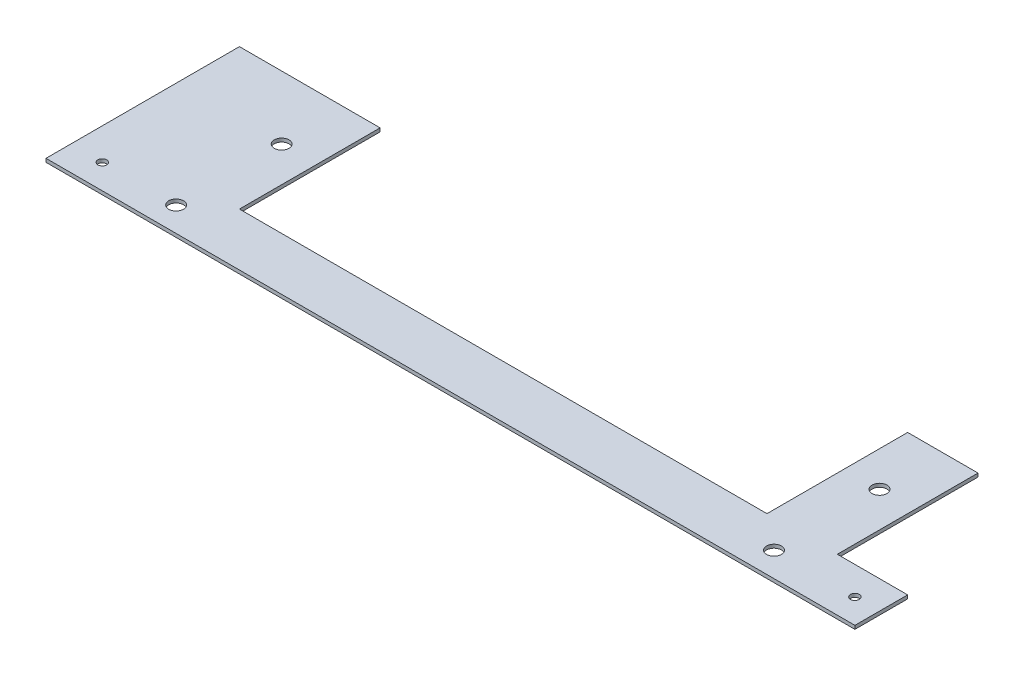
ISO-10303-21;
HEADER;
FILE_DESCRIPTION(('STEP AP214'),'2;1');
FILE_NAME('part.step','',(''),(''),'','','');
FILE_SCHEMA(('AUTOMOTIVE_DESIGN { 1 0 10303 214 1 1 1 1 }'));
ENDSEC;
DATA;
#1=APPLICATION_CONTEXT('core data for automotive mechanical design processes');
#2=APPLICATION_PROTOCOL_DEFINITION('international standard','automotive_design',2000,#1);
#3=PRODUCT_CONTEXT('',#1,'mechanical');
#4=PRODUCT('Part','Part','',(#3));
#5=PRODUCT_RELATED_PRODUCT_CATEGORY('part','',(#4));
#6=PRODUCT_DEFINITION_FORMATION('','',#4);
#7=PRODUCT_DEFINITION_CONTEXT('part definition',#1,'design');
#8=PRODUCT_DEFINITION('design','',#6,#7);
#9=PRODUCT_DEFINITION_SHAPE('','',#8);
#10=(LENGTH_UNIT() NAMED_UNIT(*) SI_UNIT(.MILLI.,.METRE.));
#11=(NAMED_UNIT(*) PLANE_ANGLE_UNIT() SI_UNIT($,.RADIAN.));
#12=(NAMED_UNIT(*) SI_UNIT($,.STERADIAN.) SOLID_ANGLE_UNIT());
#13=UNCERTAINTY_MEASURE_WITH_UNIT(LENGTH_MEASURE(1.E-05),#10,'distance_accuracy_value','');
#14=(GEOMETRIC_REPRESENTATION_CONTEXT(3) GLOBAL_UNCERTAINTY_ASSIGNED_CONTEXT((#13)) GLOBAL_UNIT_ASSIGNED_CONTEXT((#10,
#11,#12)) REPRESENTATION_CONTEXT('',''));
#15=CARTESIAN_POINT('',(0.,0.,0.));
#16=DIRECTION('',(0.,0.,1.));
#17=DIRECTION('',(1.,0.,0.));
#18=AXIS2_PLACEMENT_3D('',#15,#16,#17);
#19=CARTESIAN_POINT('',(0.,1.,15.));
#20=DIRECTION('',(0.,-1.,0.));
#21=DIRECTION('',(0.,0.,-1.));
#22=AXIS2_PLACEMENT_3D('',#19,#20,#21);
#23=PLANE('',#22);
#24=CARTESIAN_POINT('',(30.,1.,-22.));
#25=DIRECTION('',(0.,1.,0.));
#26=DIRECTION('',(0.,0.,1.));
#27=AXIS2_PLACEMENT_3D('',#24,#25,#26);
#28=CIRCLE('',#27,2.09999999999999);
#29=CARTESIAN_POINT('',(30.,1.,-19.9));
#30=VERTEX_POINT('',#29);
#31=EDGE_CURVE('E321',#30,#30,#28,.T.);
#32=ORIENTED_EDGE('',*,*,#31,.F.);
#33=EDGE_LOOP('',(#32));
#34=FACE_BOUND('',#33,.T.);
#35=CARTESIAN_POINT('',(30.,1.,8.));
#36=DIRECTION('',(0.,1.,0.));
#37=DIRECTION('',(0.,0.,1.));
#38=AXIS2_PLACEMENT_3D('',#35,#36,#37);
#39=CIRCLE('',#38,2.1);
#40=CARTESIAN_POINT('',(30.,1.,10.1));
#41=VERTEX_POINT('',#40);
#42=EDGE_CURVE('E175',#41,#41,#39,.T.);
#43=ORIENTED_EDGE('',*,*,#42,.F.);
#44=EDGE_LOOP('',(#43));
#45=FACE_BOUND('',#44,.T.);
#46=CARTESIAN_POINT('',(200.,1.,8.));
#47=DIRECTION('',(0.,1.,0.));
#48=DIRECTION('',(0.,0.,1.));
#49=AXIS2_PLACEMENT_3D('',#46,#47,#48);
#50=CIRCLE('',#49,2.09999999999999);
#51=CARTESIAN_POINT('',(200.,1.,10.1));
#52=VERTEX_POINT('',#51);
#53=EDGE_CURVE('E181',#52,#52,#50,.T.);
#54=ORIENTED_EDGE('',*,*,#53,.F.);
#55=EDGE_LOOP('',(#54));
#56=FACE_BOUND('',#55,.T.);
#57=CARTESIAN_POINT('',(9.,1.,8.));
#58=DIRECTION('',(0.,-1.,0.));
#59=DIRECTION('',(0.,0.,-1.));
#60=AXIS2_PLACEMENT_3D('',#57,#58,#59);
#61=CIRCLE('',#60,1.25);
#62=CARTESIAN_POINT('',(9.,1.,6.75));
#63=VERTEX_POINT('',#62);
#64=EDGE_CURVE('E190',#63,#63,#61,.T.);
#65=ORIENTED_EDGE('',*,*,#64,.T.);
#66=EDGE_LOOP('',(#65));
#67=FACE_BOUND('',#66,.T.);
#68=CARTESIAN_POINT('',(223.,1.,8.));
#69=DIRECTION('',(0.,-1.,0.));
#70=DIRECTION('',(0.,0.,-1.));
#71=AXIS2_PLACEMENT_3D('',#68,#69,#70);
#72=CIRCLE('',#71,1.25);
#73=CARTESIAN_POINT('',(223.,1.,6.75));
#74=VERTEX_POINT('',#73);
#75=EDGE_CURVE('E196',#74,#74,#72,.T.);
#76=ORIENTED_EDGE('',*,*,#75,.T.);
#77=EDGE_LOOP('',(#76));
#78=FACE_BOUND('',#77,.T.);
#79=DIRECTION('',(-1.,0.,0.));
#80=VECTOR('',#79,1.);
#81=CARTESIAN_POINT('',(0.,1.,0.));
#82=LINE('',#81,#80);
#83=CARTESIAN_POINT('',(230.,1.,0.));
#84=VERTEX_POINT('',#83);
#85=CARTESIAN_POINT('',(210.,1.,0.));
#86=VERTEX_POINT('',#85);
#87=EDGE_CURVE('E201',#84,#86,#82,.T.);
#88=ORIENTED_EDGE('',*,*,#87,.T.);
#89=DIRECTION('',(0.,0.,1.));
#90=VECTOR('',#89,1.);
#91=CARTESIAN_POINT('',(210.,1.,-40.));
#92=LINE('',#91,#90);
#93=CARTESIAN_POINT('',(210.,1.,-40.));
#94=VERTEX_POINT('',#93);
#95=EDGE_CURVE('E160',#94,#86,#92,.T.);
#96=ORIENTED_EDGE('',*,*,#95,.F.);
#97=DIRECTION('',(1.,0.,0.));
#98=VECTOR('',#97,1.);
#99=CARTESIAN_POINT('',(210.,1.,-40.));
#100=LINE('',#99,#98);
#101=CARTESIAN_POINT('',(190.,1.,-40.));
#102=VERTEX_POINT('',#101);
#103=EDGE_CURVE('E158',#102,#94,#100,.T.);
#104=ORIENTED_EDGE('',*,*,#103,.F.);
#105=DIRECTION('',(0.,0.,1.));
#106=VECTOR('',#105,1.);
#107=CARTESIAN_POINT('',(190.,1.,-40.));
#108=LINE('',#107,#106);
#109=CARTESIAN_POINT('',(190.,1.,0.));
#110=VERTEX_POINT('',#109);
#111=EDGE_CURVE('E167',#102,#110,#108,.T.);
#112=ORIENTED_EDGE('',*,*,#111,.T.);
#113=CARTESIAN_POINT('',(40.,0.999999999999995,0.));
#114=VERTEX_POINT('',#113);
#115=EDGE_CURVE('E210',#110,#114,#82,.T.);
#116=ORIENTED_EDGE('',*,*,#115,.T.);
#117=DIRECTION('',(0.,0.,1.));
#118=VECTOR('',#117,1.);
#119=CARTESIAN_POINT('',(40.,0.999999999999995,-40.));
#120=LINE('',#119,#118);
#121=CARTESIAN_POINT('',(40.,0.999999999999995,-40.));
#122=VERTEX_POINT('',#121);
#123=EDGE_CURVE('E130',#122,#114,#120,.T.);
#124=ORIENTED_EDGE('',*,*,#123,.F.);
#125=DIRECTION('',(1.,0.,0.));
#126=VECTOR('',#125,1.);
#127=CARTESIAN_POINT('',(0.,1.,-40.));
#128=LINE('',#127,#126);
#129=CARTESIAN_POINT('',(0.,1.,-40.));
#130=VERTEX_POINT('',#129);
#131=EDGE_CURVE('E126',#130,#122,#128,.T.);
#132=ORIENTED_EDGE('',*,*,#131,.F.);
#133=DIRECTION('',(0.,0.,-1.));
#134=VECTOR('',#133,1.);
#135=CARTESIAN_POINT('',(0.,1.,15.));
#136=LINE('',#135,#134);
#137=CARTESIAN_POINT('',(0.,1.,15.));
#138=VERTEX_POINT('',#137);
#139=EDGE_CURVE('E113',#138,#130,#136,.T.);
#140=ORIENTED_EDGE('',*,*,#139,.F.);
#141=DIRECTION('',(-1.,0.,0.));
#142=VECTOR('',#141,1.);
#143=CARTESIAN_POINT('',(0.,1.,15.));
#144=LINE('',#143,#142);
#145=CARTESIAN_POINT('',(230.,1.,15.));
#146=VERTEX_POINT('',#145);
#147=EDGE_CURVE('E123',#146,#138,#144,.T.);
#148=ORIENTED_EDGE('',*,*,#147,.F.);
#149=DIRECTION('',(0.,0.,-1.));
#150=VECTOR('',#149,1.);
#151=CARTESIAN_POINT('',(230.,1.,15.));
#152=LINE('',#151,#150);
#153=EDGE_CURVE('E122',#146,#84,#152,.T.);
#154=ORIENTED_EDGE('',*,*,#153,.T.);
#155=EDGE_LOOP('',(#88,#96,#104,#112,#116,#124,#132,#140,#148,#154));
#156=FACE_BOUND('',#155,.T.);
#157=CARTESIAN_POINT('',(200.,1.,-22.));
#158=DIRECTION('',(0.,1.,0.));
#159=DIRECTION('',(0.,0.,1.));
#160=AXIS2_PLACEMENT_3D('',#157,#158,#159);
#161=CIRCLE('',#160,2.09999999999999);
#162=CARTESIAN_POINT('',(200.,1.,-19.9));
#163=VERTEX_POINT('',#162);
#164=EDGE_CURVE('E323',#163,#163,#161,.T.);
#165=ORIENTED_EDGE('',*,*,#164,.F.);
#166=EDGE_LOOP('',(#165));
#167=FACE_BOUND('',#166,.T.);
#168=ADVANCED_FACE('F35',(#34,#45,#56,#67,#78,#156,#167),#23,.F.);
#169=CARTESIAN_POINT('',(0.,0.,0.));
#170=DIRECTION('',(0.,0.,-1.));
#171=DIRECTION('',(-1.,0.,0.));
#172=AXIS2_PLACEMENT_3D('',#169,#170,#171);
#173=PLANE('',#172);
#174=DIRECTION('',(1.,0.,0.));
#175=VECTOR('',#174,1.);
#176=CARTESIAN_POINT('',(0.,0.,0.));
#177=LINE('',#176,#175);
#178=CARTESIAN_POINT('',(40.,0.,0.));
#179=VERTEX_POINT('',#178);
#180=CARTESIAN_POINT('',(190.,0.,0.));
#181=VERTEX_POINT('',#180);
#182=EDGE_CURVE('E206',#179,#181,#177,.T.);
#183=ORIENTED_EDGE('',*,*,#182,.F.);
#184=DIRECTION('',(0.,-1.,0.));
#185=VECTOR('',#184,1.);
#186=CARTESIAN_POINT('',(40.,0.999999999999995,0.));
#187=LINE('',#186,#185);
#188=EDGE_CURVE('E138',#114,#179,#187,.T.);
#189=ORIENTED_EDGE('',*,*,#188,.F.);
#190=ORIENTED_EDGE('',*,*,#115,.F.);
#191=DIRECTION('',(0.,1.,0.));
#192=VECTOR('',#191,1.);
#193=CARTESIAN_POINT('',(190.,1.,0.));
#194=LINE('',#193,#192);
#195=EDGE_CURVE('E154',#181,#110,#194,.T.);
#196=ORIENTED_EDGE('',*,*,#195,.F.);
#197=EDGE_LOOP('',(#183,#189,#190,#196));
#198=FACE_BOUND('',#197,.T.);
#199=ADVANCED_FACE('F237',(#198),#173,.T.);
#200=DIRECTION('',(0.,-1.,0.));
#201=VECTOR('',#200,1.);
#202=CARTESIAN_POINT('',(210.,1.,0.));
#203=LINE('',#202,#201);
#204=CARTESIAN_POINT('',(210.,0.,0.));
#205=VERTEX_POINT('',#204);
#206=EDGE_CURVE('E149',#86,#205,#203,.T.);
#207=ORIENTED_EDGE('',*,*,#206,.F.);
#208=ORIENTED_EDGE('',*,*,#87,.F.);
#209=DIRECTION('',(0.,1.,0.));
#210=VECTOR('',#209,1.);
#211=CARTESIAN_POINT('',(230.,0.,0.));
#212=LINE('',#211,#210);
#213=CARTESIAN_POINT('',(230.,0.,0.));
#214=VERTEX_POINT('',#213);
#215=EDGE_CURVE('E208',#214,#84,#212,.T.);
#216=ORIENTED_EDGE('',*,*,#215,.F.);
#217=EDGE_CURVE('E58',#205,#214,#177,.T.);
#218=ORIENTED_EDGE('',*,*,#217,.F.);
#219=EDGE_LOOP('',(#207,#208,#216,#218));
#220=FACE_BOUND('',#219,.T.);
#221=ADVANCED_FACE('F220',(#220),#173,.T.);
#222=CARTESIAN_POINT('',(0.,0.,15.));
#223=DIRECTION('',(1.,0.,0.));
#224=DIRECTION('',(0.,0.,-1.));
#225=AXIS2_PLACEMENT_3D('',#222,#223,#224);
#226=PLANE('',#225);
#227=ORIENTED_EDGE('',*,*,#139,.T.);
#228=DIRECTION('',(0.,1.,0.));
#229=VECTOR('',#228,1.);
#230=CARTESIAN_POINT('',(0.,1.,-40.));
#231=LINE('',#230,#229);
#232=CARTESIAN_POINT('',(0.,0.,-40.));
#233=VERTEX_POINT('',#232);
#234=EDGE_CURVE('E117',#233,#130,#231,.T.);
#235=ORIENTED_EDGE('',*,*,#234,.F.);
#236=DIRECTION('',(0.,0.,-1.));
#237=VECTOR('',#236,1.);
#238=CARTESIAN_POINT('',(0.,0.,15.));
#239=LINE('',#238,#237);
#240=CARTESIAN_POINT('',(0.,0.,15.));
#241=VERTEX_POINT('',#240);
#242=EDGE_CURVE('E11',#241,#233,#239,.T.);
#243=ORIENTED_EDGE('',*,*,#242,.F.);
#244=DIRECTION('',(0.,-1.,0.));
#245=VECTOR('',#244,1.);
#246=CARTESIAN_POINT('',(0.,0.,15.));
#247=LINE('',#246,#245);
#248=EDGE_CURVE('E119',#138,#241,#247,.T.);
#249=ORIENTED_EDGE('',*,*,#248,.F.);
#250=EDGE_LOOP('',(#227,#235,#243,#249));
#251=FACE_BOUND('',#250,.T.);
#252=ADVANCED_FACE('F37',(#251),#226,.F.);
#253=CARTESIAN_POINT('',(0.,0.,15.));
#254=DIRECTION('',(0.,1.,0.));
#255=DIRECTION('',(0.,0.,1.));
#256=AXIS2_PLACEMENT_3D('',#253,#254,#255);
#257=PLANE('',#256);
#258=CARTESIAN_POINT('',(30.,0.,-22.));
#259=DIRECTION('',(0.,1.,0.));
#260=DIRECTION('',(0.,0.,1.));
#261=AXIS2_PLACEMENT_3D('',#258,#259,#260);
#262=CIRCLE('',#261,2.09999999999999);
#263=CARTESIAN_POINT('',(30.,0.,-19.9));
#264=VERTEX_POINT('',#263);
#265=EDGE_CURVE('E272',#264,#264,#262,.T.);
#266=ORIENTED_EDGE('',*,*,#265,.T.);
#267=EDGE_LOOP('',(#266));
#268=FACE_BOUND('',#267,.T.);
#269=CARTESIAN_POINT('',(200.,0.,-22.));
#270=DIRECTION('',(0.,1.,0.));
#271=DIRECTION('',(0.,0.,1.));
#272=AXIS2_PLACEMENT_3D('',#269,#270,#271);
#273=CIRCLE('',#272,2.09999999999999);
#274=CARTESIAN_POINT('',(200.,0.,-19.9));
#275=VERTEX_POINT('',#274);
#276=EDGE_CURVE('E140',#275,#275,#273,.T.);
#277=ORIENTED_EDGE('',*,*,#276,.T.);
#278=EDGE_LOOP('',(#277));
#279=FACE_BOUND('',#278,.T.);
#280=CARTESIAN_POINT('',(30.,0.,8.));
#281=DIRECTION('',(0.,1.,0.));
#282=DIRECTION('',(0.,0.,1.));
#283=AXIS2_PLACEMENT_3D('',#280,#281,#282);
#284=CIRCLE('',#283,2.1);
#285=CARTESIAN_POINT('',(30.,0.,10.1));
#286=VERTEX_POINT('',#285);
#287=EDGE_CURVE('E178',#286,#286,#284,.T.);
#288=ORIENTED_EDGE('',*,*,#287,.T.);
#289=EDGE_LOOP('',(#288));
#290=FACE_BOUND('',#289,.T.);
#291=CARTESIAN_POINT('',(200.,0.,8.));
#292=DIRECTION('',(0.,1.,0.));
#293=DIRECTION('',(0.,0.,1.));
#294=AXIS2_PLACEMENT_3D('',#291,#292,#293);
#295=CIRCLE('',#294,2.09999999999999);
#296=CARTESIAN_POINT('',(200.,0.,10.1));
#297=VERTEX_POINT('',#296);
#298=EDGE_CURVE('E184',#297,#297,#295,.T.);
#299=ORIENTED_EDGE('',*,*,#298,.T.);
#300=EDGE_LOOP('',(#299));
#301=FACE_BOUND('',#300,.T.);
#302=CARTESIAN_POINT('',(9.,0.,8.));
#303=DIRECTION('',(0.,-1.,0.));
#304=DIRECTION('',(0.,0.,-1.));
#305=AXIS2_PLACEMENT_3D('',#302,#303,#304);
#306=CIRCLE('',#305,1.24999999999999);
#307=CARTESIAN_POINT('',(9.,0.,6.75000000000001));
#308=VERTEX_POINT('',#307);
#309=EDGE_CURVE('E187',#308,#308,#306,.T.);
#310=ORIENTED_EDGE('',*,*,#309,.F.);
#311=EDGE_LOOP('',(#310));
#312=FACE_BOUND('',#311,.T.);
#313=CARTESIAN_POINT('',(223.,0.,8.));
#314=DIRECTION('',(0.,-1.,0.));
#315=DIRECTION('',(0.,0.,-1.));
#316=AXIS2_PLACEMENT_3D('',#313,#314,#315);
#317=CIRCLE('',#316,1.25);
#318=CARTESIAN_POINT('',(223.,0.,6.75));
#319=VERTEX_POINT('',#318);
#320=EDGE_CURVE('E193',#319,#319,#317,.T.);
#321=ORIENTED_EDGE('',*,*,#320,.F.);
#322=EDGE_LOOP('',(#321));
#323=FACE_BOUND('',#322,.T.);
#324=ORIENTED_EDGE('',*,*,#242,.T.);
#325=DIRECTION('',(-1.,0.,0.));
#326=VECTOR('',#325,1.);
#327=CARTESIAN_POINT('',(0.,0.,-40.));
#328=LINE('',#327,#326);
#329=CARTESIAN_POINT('',(40.,0.,-40.));
#330=VERTEX_POINT('',#329);
#331=EDGE_CURVE('E137',#330,#233,#328,.T.);
#332=ORIENTED_EDGE('',*,*,#331,.F.);
#333=DIRECTION('',(0.,0.,1.));
#334=VECTOR('',#333,1.);
#335=CARTESIAN_POINT('',(40.,0.,-40.));
#336=LINE('',#335,#334);
#337=EDGE_CURVE('E50',#330,#179,#336,.T.);
#338=ORIENTED_EDGE('',*,*,#337,.T.);
#339=ORIENTED_EDGE('',*,*,#182,.T.);
#340=DIRECTION('',(0.,0.,1.));
#341=VECTOR('',#340,1.);
#342=CARTESIAN_POINT('',(190.,0.,-40.));
#343=LINE('',#342,#341);
#344=CARTESIAN_POINT('',(190.,0.,-40.));
#345=VERTEX_POINT('',#344);
#346=EDGE_CURVE('E170',#345,#181,#343,.T.);
#347=ORIENTED_EDGE('',*,*,#346,.F.);
#348=DIRECTION('',(-1.,0.,0.));
#349=VECTOR('',#348,1.);
#350=CARTESIAN_POINT('',(210.,0.,-40.));
#351=LINE('',#350,#349);
#352=CARTESIAN_POINT('',(210.,0.,-40.));
#353=VERTEX_POINT('',#352);
#354=EDGE_CURVE('E153',#353,#345,#351,.T.);
#355=ORIENTED_EDGE('',*,*,#354,.F.);
#356=DIRECTION('',(0.,0.,1.));
#357=VECTOR('',#356,1.);
#358=CARTESIAN_POINT('',(210.,0.,-40.));
#359=LINE('',#358,#357);
#360=EDGE_CURVE('E173',#353,#205,#359,.T.);
#361=ORIENTED_EDGE('',*,*,#360,.T.);
#362=ORIENTED_EDGE('',*,*,#217,.T.);
#363=DIRECTION('',(0.,0.,-1.));
#364=VECTOR('',#363,1.);
#365=CARTESIAN_POINT('',(230.,0.,15.));
#366=LINE('',#365,#364);
#367=CARTESIAN_POINT('',(230.,0.,15.));
#368=VERTEX_POINT('',#367);
#369=EDGE_CURVE('E43',#368,#214,#366,.T.);
#370=ORIENTED_EDGE('',*,*,#369,.F.);
#371=DIRECTION('',(1.,0.,0.));
#372=VECTOR('',#371,1.);
#373=CARTESIAN_POINT('',(0.,0.,15.));
#374=LINE('',#373,#372);
#375=EDGE_CURVE('E200',#241,#368,#374,.T.);
#376=ORIENTED_EDGE('',*,*,#375,.F.);
#377=EDGE_LOOP('',(#324,#332,#338,#339,#347,#355,#361,#362,#370,#376));
#378=FACE_BOUND('',#377,.T.);
#379=ADVANCED_FACE('F241',(#268,#279,#290,#301,#312,#323,#378),#257,.F.);
#380=CARTESIAN_POINT('',(230.,0.,15.));
#381=DIRECTION('',(-1.,0.,0.));
#382=DIRECTION('',(0.,0.,1.));
#383=AXIS2_PLACEMENT_3D('',#380,#381,#382);
#384=PLANE('',#383);
#385=ORIENTED_EDGE('',*,*,#215,.T.);
#386=ORIENTED_EDGE('',*,*,#153,.F.);
#387=DIRECTION('',(0.,1.,0.));
#388=VECTOR('',#387,1.);
#389=CARTESIAN_POINT('',(230.,0.,15.));
#390=LINE('',#389,#388);
#391=EDGE_CURVE('E203',#368,#146,#390,.T.);
#392=ORIENTED_EDGE('',*,*,#391,.F.);
#393=ORIENTED_EDGE('',*,*,#369,.T.);
#394=EDGE_LOOP('',(#385,#386,#392,#393));
#395=FACE_BOUND('',#394,.T.);
#396=ADVANCED_FACE('F217',(#395),#384,.F.);
#397=CARTESIAN_POINT('',(0.,0.,15.));
#398=DIRECTION('',(0.,0.,-1.));
#399=DIRECTION('',(-1.,0.,0.));
#400=AXIS2_PLACEMENT_3D('',#397,#398,#399);
#401=PLANE('',#400);
#402=ORIENTED_EDGE('',*,*,#248,.T.);
#403=ORIENTED_EDGE('',*,*,#375,.T.);
#404=ORIENTED_EDGE('',*,*,#391,.T.);
#405=ORIENTED_EDGE('',*,*,#147,.T.);
#406=EDGE_LOOP('',(#402,#403,#404,#405));
#407=FACE_BOUND('',#406,.T.);
#408=ADVANCED_FACE('F243',(#407),#401,.F.);
#409=CARTESIAN_POINT('',(223.,0.,8.));
#410=DIRECTION('',(0.,-1.,0.));
#411=DIRECTION('',(0.,0.,-1.));
#412=AXIS2_PLACEMENT_3D('',#409,#410,#411);
#413=CYLINDRICAL_SURFACE('',#412,1.25);
#414=ORIENTED_EDGE('',*,*,#75,.F.);
#415=EDGE_LOOP('',(#414));
#416=FACE_BOUND('',#415,.T.);
#417=ORIENTED_EDGE('',*,*,#320,.T.);
#418=EDGE_LOOP('',(#417));
#419=FACE_BOUND('',#418,.T.);
#420=ADVANCED_FACE('F245',(#416,#419),#413,.F.);
#421=CARTESIAN_POINT('',(9.,0.,8.));
#422=DIRECTION('',(0.,-1.,0.));
#423=DIRECTION('',(0.,0.,-1.));
#424=AXIS2_PLACEMENT_3D('',#421,#422,#423);
#425=CYLINDRICAL_SURFACE('',#424,1.24999999999999);
#426=ORIENTED_EDGE('',*,*,#64,.F.);
#427=EDGE_LOOP('',(#426));
#428=FACE_BOUND('',#427,.T.);
#429=ORIENTED_EDGE('',*,*,#309,.T.);
#430=EDGE_LOOP('',(#429));
#431=FACE_BOUND('',#430,.T.);
#432=ADVANCED_FACE('F251',(#428,#431),#425,.F.);
#433=CARTESIAN_POINT('',(200.,1.,8.));
#434=DIRECTION('',(0.,1.,0.));
#435=DIRECTION('',(0.,0.,1.));
#436=AXIS2_PLACEMENT_3D('',#433,#434,#435);
#437=CYLINDRICAL_SURFACE('',#436,2.09999999999999);
#438=ORIENTED_EDGE('',*,*,#298,.F.);
#439=EDGE_LOOP('',(#438));
#440=FACE_BOUND('',#439,.T.);
#441=ORIENTED_EDGE('',*,*,#53,.T.);
#442=EDGE_LOOP('',(#441));
#443=FACE_BOUND('',#442,.T.);
#444=ADVANCED_FACE('F286',(#440,#443),#437,.F.);
#445=CARTESIAN_POINT('',(30.,1.,8.));
#446=DIRECTION('',(0.,1.,0.));
#447=DIRECTION('',(0.,0.,1.));
#448=AXIS2_PLACEMENT_3D('',#445,#446,#447);
#449=CYLINDRICAL_SURFACE('',#448,2.1);
#450=ORIENTED_EDGE('',*,*,#287,.F.);
#451=EDGE_LOOP('',(#450));
#452=FACE_BOUND('',#451,.T.);
#453=ORIENTED_EDGE('',*,*,#42,.T.);
#454=EDGE_LOOP('',(#453));
#455=FACE_BOUND('',#454,.T.);
#456=ADVANCED_FACE('F292',(#452,#455),#449,.F.);
#457=CARTESIAN_POINT('',(210.,1.,-40.));
#458=DIRECTION('',(-1.,0.,0.));
#459=DIRECTION('',(0.,0.,1.));
#460=AXIS2_PLACEMENT_3D('',#457,#458,#459);
#461=PLANE('',#460);
#462=ORIENTED_EDGE('',*,*,#206,.T.);
#463=ORIENTED_EDGE('',*,*,#360,.F.);
#464=DIRECTION('',(0.,-1.,0.));
#465=VECTOR('',#464,1.);
#466=CARTESIAN_POINT('',(210.,1.,-40.));
#467=LINE('',#466,#465);
#468=EDGE_CURVE('E150',#94,#353,#467,.T.);
#469=ORIENTED_EDGE('',*,*,#468,.F.);
#470=ORIENTED_EDGE('',*,*,#95,.T.);
#471=EDGE_LOOP('',(#462,#463,#469,#470));
#472=FACE_BOUND('',#471,.T.);
#473=ADVANCED_FACE('F225',(#472),#461,.F.);
#474=CARTESIAN_POINT('',(190.,1.,-40.));
#475=DIRECTION('',(1.,0.,0.));
#476=DIRECTION('',(0.,0.,-1.));
#477=AXIS2_PLACEMENT_3D('',#474,#475,#476);
#478=PLANE('',#477);
#479=ORIENTED_EDGE('',*,*,#195,.T.);
#480=ORIENTED_EDGE('',*,*,#111,.F.);
#481=DIRECTION('',(0.,1.,0.));
#482=VECTOR('',#481,1.);
#483=CARTESIAN_POINT('',(190.,1.,-40.));
#484=LINE('',#483,#482);
#485=EDGE_CURVE('E156',#345,#102,#484,.T.);
#486=ORIENTED_EDGE('',*,*,#485,.F.);
#487=ORIENTED_EDGE('',*,*,#346,.T.);
#488=EDGE_LOOP('',(#479,#480,#486,#487));
#489=FACE_BOUND('',#488,.T.);
#490=ADVANCED_FACE('F233',(#489),#478,.F.);
#491=CARTESIAN_POINT('',(0.,0.,-40.));
#492=DIRECTION('',(0.,0.,-1.));
#493=DIRECTION('',(-1.,0.,0.));
#494=AXIS2_PLACEMENT_3D('',#491,#492,#493);
#495=PLANE('',#494);
#496=ORIENTED_EDGE('',*,*,#468,.T.);
#497=ORIENTED_EDGE('',*,*,#354,.T.);
#498=ORIENTED_EDGE('',*,*,#485,.T.);
#499=ORIENTED_EDGE('',*,*,#103,.T.);
#500=EDGE_LOOP('',(#496,#497,#498,#499));
#501=FACE_BOUND('',#500,.T.);
#502=ADVANCED_FACE('F228',(#501),#495,.T.);
#503=CARTESIAN_POINT('',(40.,0.999999999999995,-40.));
#504=DIRECTION('',(-1.,0.,0.));
#505=DIRECTION('',(0.,0.,1.));
#506=AXIS2_PLACEMENT_3D('',#503,#504,#505);
#507=PLANE('',#506);
#508=ORIENTED_EDGE('',*,*,#188,.T.);
#509=ORIENTED_EDGE('',*,*,#337,.F.);
#510=DIRECTION('',(0.,-1.,0.));
#511=VECTOR('',#510,1.);
#512=CARTESIAN_POINT('',(40.,0.999999999999995,-40.));
#513=LINE('',#512,#511);
#514=EDGE_CURVE('E133',#122,#330,#513,.T.);
#515=ORIENTED_EDGE('',*,*,#514,.F.);
#516=ORIENTED_EDGE('',*,*,#123,.T.);
#517=EDGE_LOOP('',(#508,#509,#515,#516));
#518=FACE_BOUND('',#517,.T.);
#519=ADVANCED_FACE('F240',(#518),#507,.F.);
#520=CARTESIAN_POINT('',(0.,0.,-40.));
#521=DIRECTION('',(0.,0.,1.));
#522=DIRECTION('',(1.,0.,0.));
#523=AXIS2_PLACEMENT_3D('',#520,#521,#522);
#524=PLANE('',#523);
#525=ORIENTED_EDGE('',*,*,#234,.T.);
#526=ORIENTED_EDGE('',*,*,#131,.T.);
#527=ORIENTED_EDGE('',*,*,#514,.T.);
#528=ORIENTED_EDGE('',*,*,#331,.T.);
#529=EDGE_LOOP('',(#525,#526,#527,#528));
#530=FACE_BOUND('',#529,.T.);
#531=ADVANCED_FACE('F136',(#530),#524,.F.);
#532=CARTESIAN_POINT('',(200.,1.,-22.));
#533=DIRECTION('',(0.,1.,0.));
#534=DIRECTION('',(0.,0.,1.));
#535=AXIS2_PLACEMENT_3D('',#532,#533,#534);
#536=CYLINDRICAL_SURFACE('',#535,2.09999999999999);
#537=ORIENTED_EDGE('',*,*,#276,.F.);
#538=EDGE_LOOP('',(#537));
#539=FACE_BOUND('',#538,.T.);
#540=ORIENTED_EDGE('',*,*,#164,.T.);
#541=EDGE_LOOP('',(#540));
#542=FACE_BOUND('',#541,.T.);
#543=ADVANCED_FACE('F310',(#539,#542),#536,.F.);
#544=CARTESIAN_POINT('',(30.,1.,-22.));
#545=DIRECTION('',(0.,1.,0.));
#546=DIRECTION('',(0.,0.,1.));
#547=AXIS2_PLACEMENT_3D('',#544,#545,#546);
#548=CYLINDRICAL_SURFACE('',#547,2.09999999999999);
#549=ORIENTED_EDGE('',*,*,#265,.F.);
#550=EDGE_LOOP('',(#549));
#551=FACE_BOUND('',#550,.T.);
#552=ORIENTED_EDGE('',*,*,#31,.T.);
#553=EDGE_LOOP('',(#552));
#554=FACE_BOUND('',#553,.T.);
#555=ADVANCED_FACE('F313',(#551,#554),#548,.F.);
#556=CLOSED_SHELL('',(#168,#199,#221,#252,#379,#396,#408,#420,#432,#444,#456,#473,#490,#502,
#519,#531,#543,#555));
#557=MANIFOLD_SOLID_BREP('B2',#556);
#558=ADVANCED_BREP_SHAPE_REPRESENTATION('',(#18,#557),#14);
#559=SHAPE_DEFINITION_REPRESENTATION(#9,#558);
ENDSEC;
END-ISO-10303-21;
